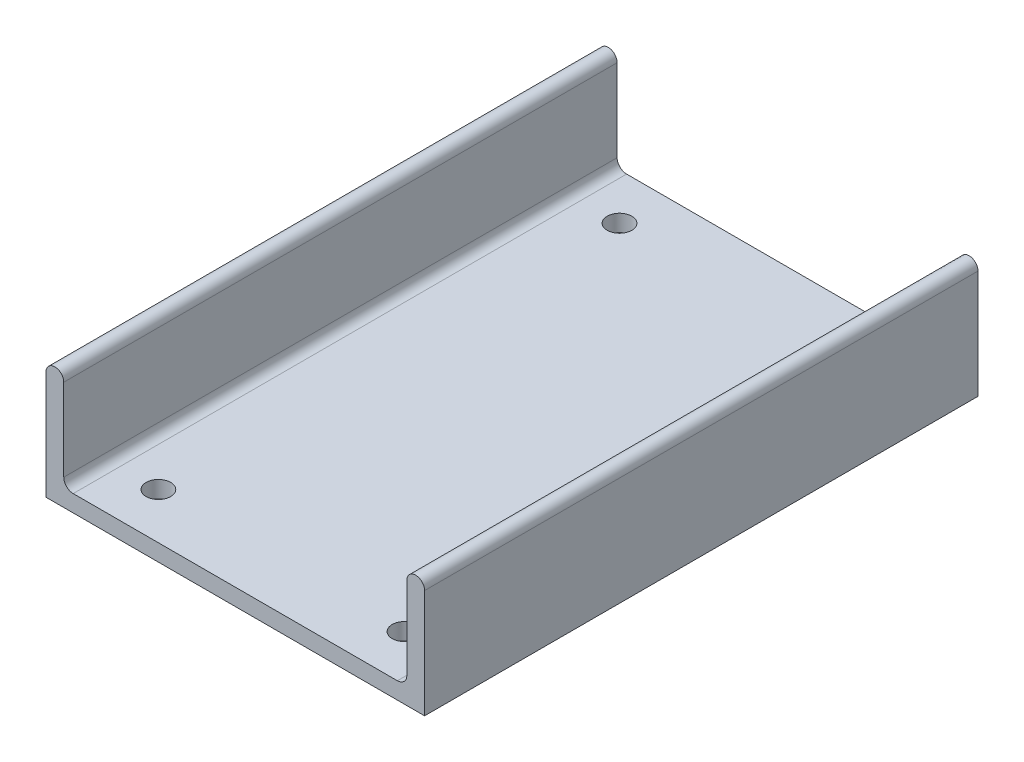
ISO-10303-21;
HEADER;
FILE_DESCRIPTION(('STEP AP214'),'2;1');
FILE_NAME('part.step','',(''),(''),'','','');
FILE_SCHEMA(('AUTOMOTIVE_DESIGN { 1 0 10303 214 1 1 1 1 }'));
ENDSEC;
DATA;
#1=APPLICATION_CONTEXT('core data for automotive mechanical design processes');
#2=APPLICATION_PROTOCOL_DEFINITION('international standard','automotive_design',2000,#1);
#3=PRODUCT_CONTEXT('',#1,'mechanical');
#4=PRODUCT('Part','Part','',(#3));
#5=PRODUCT_RELATED_PRODUCT_CATEGORY('part','',(#4));
#6=PRODUCT_DEFINITION_FORMATION('','',#4);
#7=PRODUCT_DEFINITION_CONTEXT('part definition',#1,'design');
#8=PRODUCT_DEFINITION('design','',#6,#7);
#9=PRODUCT_DEFINITION_SHAPE('','',#8);
#10=(LENGTH_UNIT() NAMED_UNIT(*) SI_UNIT(.MILLI.,.METRE.));
#11=(NAMED_UNIT(*) PLANE_ANGLE_UNIT() SI_UNIT($,.RADIAN.));
#12=(NAMED_UNIT(*) SI_UNIT($,.STERADIAN.) SOLID_ANGLE_UNIT());
#13=UNCERTAINTY_MEASURE_WITH_UNIT(LENGTH_MEASURE(1.E-05),#10,'distance_accuracy_value','');
#14=(GEOMETRIC_REPRESENTATION_CONTEXT(3) GLOBAL_UNCERTAINTY_ASSIGNED_CONTEXT((#13)) GLOBAL_UNIT_ASSIGNED_CONTEXT((#10,
#11,#12)) REPRESENTATION_CONTEXT('',''));
#15=CARTESIAN_POINT('',(0.,0.,0.));
#16=DIRECTION('',(0.,0.,1.));
#17=DIRECTION('',(1.,0.,0.));
#18=AXIS2_PLACEMENT_3D('',#15,#16,#17);
#19=CARTESIAN_POINT('',(-50.8,0.,74.25436));
#20=DIRECTION('',(-1.,0.,0.));
#21=DIRECTION('',(0.,0.,1.));
#22=AXIS2_PLACEMENT_3D('',#19,#20,#21);
#23=PLANE('',#22);
#24=DIRECTION('',(0.,1.,0.));
#25=VECTOR('',#24,1.);
#26=CARTESIAN_POINT('',(-50.8,0.,-74.25436));
#27=LINE('',#26,#25);
#28=CARTESIAN_POINT('',(-50.8,0.254,-74.25436));
#29=VERTEX_POINT('',#28);
#30=CARTESIAN_POINT('',(-50.8,29.36875,-74.25436));
#31=VERTEX_POINT('',#30);
#32=EDGE_CURVE('E135',#29,#31,#27,.T.);
#33=ORIENTED_EDGE('',*,*,#32,.F.);
#34=DIRECTION('',(0.,0.,-1.));
#35=VECTOR('',#34,1.);
#36=CARTESIAN_POINT('',(-50.8,0.254,74.25536));
#37=LINE('',#36,#35);
#38=CARTESIAN_POINT('',(-50.8,0.254,74.25436));
#39=VERTEX_POINT('',#38);
#40=EDGE_CURVE('E119',#39,#29,#37,.T.);
#41=ORIENTED_EDGE('',*,*,#40,.F.);
#42=DIRECTION('',(0.,1.,0.));
#43=VECTOR('',#42,1.);
#44=CARTESIAN_POINT('',(-50.8,0.,74.25436));
#45=LINE('',#44,#43);
#46=CARTESIAN_POINT('',(-50.8,29.36875,74.25436));
#47=VERTEX_POINT('',#46);
#48=EDGE_CURVE('E170',#39,#47,#45,.T.);
#49=ORIENTED_EDGE('',*,*,#48,.T.);
#50=DIRECTION('',(0.,0.,-1.));
#51=VECTOR('',#50,1.);
#52=CARTESIAN_POINT('',(-50.8,29.36875,74.25436));
#53=LINE('',#52,#51);
#54=EDGE_CURVE('E143',#47,#31,#53,.T.);
#55=ORIENTED_EDGE('',*,*,#54,.T.);
#56=EDGE_LOOP('',(#33,#41,#49,#55));
#57=FACE_BOUND('',#56,.T.);
#58=ADVANCED_FACE('F43',(#57),#23,.T.);
#59=CARTESIAN_POINT('',(0.,0.,74.25436));
#60=DIRECTION('',(0.,0.,-1.));
#61=DIRECTION('',(-1.,0.,0.));
#62=AXIS2_PLACEMENT_3D('',#59,#60,#61);
#63=PLANE('',#62);
#64=DIRECTION('',(1.,0.,0.));
#65=VECTOR('',#64,1.);
#66=CARTESIAN_POINT('',(-50.8,0.254,74.25436));
#67=LINE('',#66,#65);
#68=CARTESIAN_POINT('',(50.8,0.254,74.25436));
#69=VERTEX_POINT('',#68);
#70=EDGE_CURVE('E123',#39,#69,#67,.T.);
#71=ORIENTED_EDGE('',*,*,#70,.T.);
#72=DIRECTION('',(0.,1.,0.));
#73=VECTOR('',#72,1.);
#74=CARTESIAN_POINT('',(50.8,0.,74.25436));
#75=LINE('',#74,#73);
#76=CARTESIAN_POINT('',(50.8,29.36875,74.25436));
#77=VERTEX_POINT('',#76);
#78=EDGE_CURVE('E227',#69,#77,#75,.T.);
#79=ORIENTED_EDGE('',*,*,#78,.T.);
#80=CARTESIAN_POINT('',(48.41875,29.36875,74.25436));
#81=DIRECTION('',(0.,0.,1.));
#82=DIRECTION('',(1.,0.,0.));
#83=AXIS2_PLACEMENT_3D('',#80,#81,#82);
#84=CIRCLE('',#83,2.38125);
#85=CARTESIAN_POINT('',(46.0375,29.36875,74.25436));
#86=VERTEX_POINT('',#85);
#87=EDGE_CURVE('E238',#86,#77,#84,.F.);
#88=ORIENTED_EDGE('',*,*,#87,.F.);
#89=DIRECTION('',(0.,1.,0.));
#90=VECTOR('',#89,1.);
#91=CARTESIAN_POINT('',(46.0375,0.,74.25436));
#92=LINE('',#91,#90);
#93=CARTESIAN_POINT('',(46.0375,7.3025,74.25436));
#94=VERTEX_POINT('',#93);
#95=EDGE_CURVE('E224',#94,#86,#92,.T.);
#96=ORIENTED_EDGE('',*,*,#95,.F.);
#97=CARTESIAN_POINT('',(43.4975,7.3025,74.25436));
#98=DIRECTION('',(0.,0.,1.));
#99=DIRECTION('',(1.,0.,0.));
#100=AXIS2_PLACEMENT_3D('',#97,#98,#99);
#101=CIRCLE('',#100,2.54);
#102=CARTESIAN_POINT('',(43.4975,4.7625,74.25436));
#103=VERTEX_POINT('',#102);
#104=EDGE_CURVE('E157',#103,#94,#101,.T.);
#105=ORIENTED_EDGE('',*,*,#104,.F.);
#106=DIRECTION('',(1.,0.,0.));
#107=VECTOR('',#106,1.);
#108=CARTESIAN_POINT('',(0.,4.7625,74.25436));
#109=LINE('',#108,#107);
#110=CARTESIAN_POINT('',(-43.4975,4.7625,74.25436));
#111=VERTEX_POINT('',#110);
#112=EDGE_CURVE('E172',#103,#111,#109,.F.);
#113=ORIENTED_EDGE('',*,*,#112,.T.);
#114=CARTESIAN_POINT('',(-43.4975,7.3025,74.25436));
#115=DIRECTION('',(0.,0.,-1.));
#116=DIRECTION('',(-1.,0.,0.));
#117=AXIS2_PLACEMENT_3D('',#114,#115,#116);
#118=CIRCLE('',#117,2.54);
#119=CARTESIAN_POINT('',(-46.0375,7.3025,74.25436));
#120=VERTEX_POINT('',#119);
#121=EDGE_CURVE('E11',#111,#120,#118,.T.);
#122=ORIENTED_EDGE('',*,*,#121,.T.);
#123=DIRECTION('',(0.,1.,0.));
#124=VECTOR('',#123,1.);
#125=CARTESIAN_POINT('',(-46.0375,0.,74.25436));
#126=LINE('',#125,#124);
#127=CARTESIAN_POINT('',(-46.0375,29.36875,74.25436));
#128=VERTEX_POINT('',#127);
#129=EDGE_CURVE('E167',#120,#128,#126,.T.);
#130=ORIENTED_EDGE('',*,*,#129,.T.);
#131=CARTESIAN_POINT('',(-48.41875,29.36875,74.25436));
#132=DIRECTION('',(0.,0.,-1.));
#133=DIRECTION('',(-1.,0.,0.));
#134=AXIS2_PLACEMENT_3D('',#131,#132,#133);
#135=CIRCLE('',#134,2.38125);
#136=EDGE_CURVE('E181',#128,#47,#135,.F.);
#137=ORIENTED_EDGE('',*,*,#136,.T.);
#138=ORIENTED_EDGE('',*,*,#48,.F.);
#139=EDGE_LOOP('',(#71,#79,#88,#96,#105,#113,#122,#130,#137,#138));
#140=FACE_BOUND('',#139,.T.);
#141=ADVANCED_FACE('F261',(#140),#63,.F.);
#142=CARTESIAN_POINT('',(0.,0.,-74.25436));
#143=DIRECTION('',(0.,0.,1.));
#144=DIRECTION('',(-1.,0.,0.));
#145=AXIS2_PLACEMENT_3D('',#142,#143,#144);
#146=PLANE('',#145);
#147=DIRECTION('',(1.,0.,0.));
#148=VECTOR('',#147,1.);
#149=CARTESIAN_POINT('',(-50.8,0.254,-74.25436));
#150=LINE('',#149,#148);
#151=CARTESIAN_POINT('',(50.8,0.254,-74.25436));
#152=VERTEX_POINT('',#151);
#153=EDGE_CURVE('E61',#29,#152,#150,.T.);
#154=ORIENTED_EDGE('',*,*,#153,.F.);
#155=ORIENTED_EDGE('',*,*,#32,.T.);
#156=CARTESIAN_POINT('',(-48.41875,29.36875,-74.25436));
#157=DIRECTION('',(0.,0.,-1.));
#158=DIRECTION('',(-1.,0.,0.));
#159=AXIS2_PLACEMENT_3D('',#156,#157,#158);
#160=CIRCLE('',#159,2.38125);
#161=CARTESIAN_POINT('',(-46.0375,29.36875,-74.25436));
#162=VERTEX_POINT('',#161);
#163=EDGE_CURVE('E153',#162,#31,#160,.F.);
#164=ORIENTED_EDGE('',*,*,#163,.F.);
#165=DIRECTION('',(0.,1.,0.));
#166=VECTOR('',#165,1.);
#167=CARTESIAN_POINT('',(-46.0375,0.,-74.25436));
#168=LINE('',#167,#166);
#169=CARTESIAN_POINT('',(-46.0375,7.3025,-74.25436));
#170=VERTEX_POINT('',#169);
#171=EDGE_CURVE('E147',#170,#162,#168,.T.);
#172=ORIENTED_EDGE('',*,*,#171,.F.);
#173=CARTESIAN_POINT('',(-43.4975,7.3025,-74.25436));
#174=DIRECTION('',(0.,0.,-1.));
#175=DIRECTION('',(-1.,0.,0.));
#176=AXIS2_PLACEMENT_3D('',#173,#174,#175);
#177=CIRCLE('',#176,2.54);
#178=CARTESIAN_POINT('',(-43.4975,4.7625,-74.25436));
#179=VERTEX_POINT('',#178);
#180=EDGE_CURVE('E163',#179,#170,#177,.T.);
#181=ORIENTED_EDGE('',*,*,#180,.F.);
#182=DIRECTION('',(1.,0.,0.));
#183=VECTOR('',#182,1.);
#184=CARTESIAN_POINT('',(0.,4.7625,-74.25436));
#185=LINE('',#184,#183);
#186=CARTESIAN_POINT('',(43.4975,4.7625,-74.25436));
#187=VERTEX_POINT('',#186);
#188=EDGE_CURVE('E146',#187,#179,#185,.F.);
#189=ORIENTED_EDGE('',*,*,#188,.F.);
#190=CARTESIAN_POINT('',(43.4975,7.3025,-74.25436));
#191=DIRECTION('',(0.,0.,1.));
#192=DIRECTION('',(1.,0.,0.));
#193=AXIS2_PLACEMENT_3D('',#190,#191,#192);
#194=CIRCLE('',#193,2.54);
#195=CARTESIAN_POINT('',(46.0375,7.3025,-74.25436));
#196=VERTEX_POINT('',#195);
#197=EDGE_CURVE('E220',#187,#196,#194,.T.);
#198=ORIENTED_EDGE('',*,*,#197,.T.);
#199=DIRECTION('',(0.,1.,0.));
#200=VECTOR('',#199,1.);
#201=CARTESIAN_POINT('',(46.0375,0.,-74.25436));
#202=LINE('',#201,#200);
#203=CARTESIAN_POINT('',(46.0375,29.36875,-74.25436));
#204=VERTEX_POINT('',#203);
#205=EDGE_CURVE('E193',#196,#204,#202,.T.);
#206=ORIENTED_EDGE('',*,*,#205,.T.);
#207=CARTESIAN_POINT('',(48.41875,29.36875,-74.25436));
#208=DIRECTION('',(0.,0.,1.));
#209=DIRECTION('',(1.,0.,0.));
#210=AXIS2_PLACEMENT_3D('',#207,#208,#209);
#211=CIRCLE('',#210,2.38125);
#212=CARTESIAN_POINT('',(50.8,29.36875,-74.25436));
#213=VERTEX_POINT('',#212);
#214=EDGE_CURVE('E217',#204,#213,#211,.F.);
#215=ORIENTED_EDGE('',*,*,#214,.T.);
#216=DIRECTION('',(0.,1.,0.));
#217=VECTOR('',#216,1.);
#218=CARTESIAN_POINT('',(50.8,0.,-74.25436));
#219=LINE('',#218,#217);
#220=EDGE_CURVE('E138',#152,#213,#219,.T.);
#221=ORIENTED_EDGE('',*,*,#220,.F.);
#222=EDGE_LOOP('',(#154,#155,#164,#172,#181,#189,#198,#206,#215,#221));
#223=FACE_BOUND('',#222,.T.);
#224=ADVANCED_FACE('F133',(#223),#146,.F.);
#225=CARTESIAN_POINT('',(50.8,0.,74.25436));
#226=DIRECTION('',(1.,0.,0.));
#227=DIRECTION('',(0.,0.,1.));
#228=AXIS2_PLACEMENT_3D('',#225,#226,#227);
#229=PLANE('',#228);
#230=ORIENTED_EDGE('',*,*,#78,.F.);
#231=DIRECTION('',(0.,0.,-1.));
#232=VECTOR('',#231,1.);
#233=CARTESIAN_POINT('',(50.8,0.254,74.25536));
#234=LINE('',#233,#232);
#235=EDGE_CURVE('E128',#69,#152,#234,.T.);
#236=ORIENTED_EDGE('',*,*,#235,.T.);
#237=ORIENTED_EDGE('',*,*,#220,.T.);
#238=DIRECTION('',(0.,0.,-1.));
#239=VECTOR('',#238,1.);
#240=CARTESIAN_POINT('',(50.8,29.36875,74.25436));
#241=LINE('',#240,#239);
#242=EDGE_CURVE('E234',#77,#213,#241,.T.);
#243=ORIENTED_EDGE('',*,*,#242,.F.);
#244=EDGE_LOOP('',(#230,#236,#237,#243));
#245=FACE_BOUND('',#244,.T.);
#246=ADVANCED_FACE('F302',(#245),#229,.T.);
#247=CARTESIAN_POINT('',(33.02,0.,-61.87186));
#248=DIRECTION('',(0.,-1.,0.));
#249=DIRECTION('',(0.,0.,-1.));
#250=AXIS2_PLACEMENT_3D('',#247,#248,#249);
#251=CYLINDRICAL_SURFACE('',#250,3.29999999999999);
#252=CARTESIAN_POINT('',(33.02,4.7625,-61.87186));
#253=DIRECTION('',(0.,-1.,0.));
#254=DIRECTION('',(0.,0.,-1.));
#255=AXIS2_PLACEMENT_3D('',#252,#253,#254);
#256=CIRCLE('',#255,3.29999999999999);
#257=CARTESIAN_POINT('',(33.02,4.7625,-65.17186));
#258=VERTEX_POINT('',#257);
#259=EDGE_CURVE('E190',#258,#258,#256,.T.);
#260=ORIENTED_EDGE('',*,*,#259,.F.);
#261=EDGE_LOOP('',(#260));
#262=FACE_BOUND('',#261,.T.);
#263=CARTESIAN_POINT('',(33.02,0.254,-61.87186));
#264=DIRECTION('',(0.,1.,0.));
#265=DIRECTION('',(0.,0.,1.));
#266=AXIS2_PLACEMENT_3D('',#263,#264,#265);
#267=CIRCLE('',#266,3.29999999999999);
#268=CARTESIAN_POINT('',(33.02,0.254,-58.57186));
#269=VERTEX_POINT('',#268);
#270=EDGE_CURVE('E335',#269,#269,#267,.T.);
#271=ORIENTED_EDGE('',*,*,#270,.F.);
#272=EDGE_LOOP('',(#271));
#273=FACE_BOUND('',#272,.T.);
#274=ADVANCED_FACE('F311',(#262,#273),#251,.F.);
#275=CARTESIAN_POINT('',(-33.02,0.,-61.87186));
#276=DIRECTION('',(0.,-1.,0.));
#277=DIRECTION('',(0.,0.,-1.));
#278=AXIS2_PLACEMENT_3D('',#275,#276,#277);
#279=CYLINDRICAL_SURFACE('',#278,3.29999999999999);
#280=CARTESIAN_POINT('',(-33.02,4.7625,-61.87186));
#281=DIRECTION('',(0.,-1.,0.));
#282=DIRECTION('',(0.,0.,-1.));
#283=AXIS2_PLACEMENT_3D('',#280,#281,#282);
#284=CIRCLE('',#283,3.29999999999999);
#285=CARTESIAN_POINT('',(-33.02,4.7625,-65.17186));
#286=VERTEX_POINT('',#285);
#287=EDGE_CURVE('E194',#286,#286,#284,.T.);
#288=ORIENTED_EDGE('',*,*,#287,.F.);
#289=EDGE_LOOP('',(#288));
#290=FACE_BOUND('',#289,.T.);
#291=CARTESIAN_POINT('',(-33.02,0.254,-61.87186));
#292=DIRECTION('',(0.,1.,0.));
#293=DIRECTION('',(0.,0.,1.));
#294=AXIS2_PLACEMENT_3D('',#291,#292,#293);
#295=CIRCLE('',#294,3.29999999999999);
#296=CARTESIAN_POINT('',(-33.02,0.254,-58.57186));
#297=VERTEX_POINT('',#296);
#298=EDGE_CURVE('E140',#297,#297,#295,.T.);
#299=ORIENTED_EDGE('',*,*,#298,.F.);
#300=EDGE_LOOP('',(#299));
#301=FACE_BOUND('',#300,.T.);
#302=ADVANCED_FACE('F315',(#290,#301),#279,.F.);
#303=CARTESIAN_POINT('',(33.02,0.,61.87186));
#304=DIRECTION('',(0.,-1.,0.));
#305=DIRECTION('',(0.,0.,-1.));
#306=AXIS2_PLACEMENT_3D('',#303,#304,#305);
#307=CYLINDRICAL_SURFACE('',#306,3.29999999999999);
#308=CARTESIAN_POINT('',(33.02,4.7625,61.87186));
#309=DIRECTION('',(0.,-1.,0.));
#310=DIRECTION('',(0.,0.,-1.));
#311=AXIS2_PLACEMENT_3D('',#308,#309,#310);
#312=CIRCLE('',#311,3.29999999999999);
#313=CARTESIAN_POINT('',(33.02,4.7625,58.57186));
#314=VERTEX_POINT('',#313);
#315=EDGE_CURVE('E197',#314,#314,#312,.T.);
#316=ORIENTED_EDGE('',*,*,#315,.F.);
#317=EDGE_LOOP('',(#316));
#318=FACE_BOUND('',#317,.T.);
#319=CARTESIAN_POINT('',(33.02,0.254,61.87186));
#320=DIRECTION('',(0.,-1.,0.));
#321=DIRECTION('',(0.,0.,-1.));
#322=AXIS2_PLACEMENT_3D('',#319,#320,#321);
#323=CIRCLE('',#322,3.29999999999999);
#324=CARTESIAN_POINT('',(33.02,0.254,58.57186));
#325=VERTEX_POINT('',#324);
#326=EDGE_CURVE('E129',#325,#325,#323,.T.);
#327=ORIENTED_EDGE('',*,*,#326,.T.);
#328=EDGE_LOOP('',(#327));
#329=FACE_BOUND('',#328,.T.);
#330=ADVANCED_FACE('F286',(#318,#329),#307,.F.);
#331=CARTESIAN_POINT('',(-33.02,0.,61.87186));
#332=DIRECTION('',(0.,-1.,0.));
#333=DIRECTION('',(0.,0.,-1.));
#334=AXIS2_PLACEMENT_3D('',#331,#332,#333);
#335=CYLINDRICAL_SURFACE('',#334,3.29999999999999);
#336=CARTESIAN_POINT('',(-33.02,4.7625,61.87186));
#337=DIRECTION('',(0.,-1.,0.));
#338=DIRECTION('',(0.,0.,-1.));
#339=AXIS2_PLACEMENT_3D('',#336,#337,#338);
#340=CIRCLE('',#339,3.29999999999999);
#341=CARTESIAN_POINT('',(-33.02,4.7625,58.57186));
#342=VERTEX_POINT('',#341);
#343=EDGE_CURVE('E47',#342,#342,#340,.T.);
#344=ORIENTED_EDGE('',*,*,#343,.F.);
#345=EDGE_LOOP('',(#344));
#346=FACE_BOUND('',#345,.T.);
#347=CARTESIAN_POINT('',(-33.02,0.254,61.87186));
#348=DIRECTION('',(0.,-1.,0.));
#349=DIRECTION('',(0.,0.,-1.));
#350=AXIS2_PLACEMENT_3D('',#347,#348,#349);
#351=CIRCLE('',#350,3.29999999999999);
#352=CARTESIAN_POINT('',(-33.02,0.254,58.57186));
#353=VERTEX_POINT('',#352);
#354=EDGE_CURVE('E332',#353,#353,#351,.T.);
#355=ORIENTED_EDGE('',*,*,#354,.T.);
#356=EDGE_LOOP('',(#355));
#357=FACE_BOUND('',#356,.T.);
#358=ADVANCED_FACE('F280',(#346,#357),#335,.F.);
#359=CARTESIAN_POINT('',(-48.41875,29.36875,0.));
#360=DIRECTION('',(0.,0.,-1.));
#361=DIRECTION('',(-1.,0.,0.));
#362=AXIS2_PLACEMENT_3D('',#359,#360,#361);
#363=CYLINDRICAL_SURFACE('',#362,2.38125);
#364=DIRECTION('',(0.,0.,1.));
#365=VECTOR('',#364,1.);
#366=CARTESIAN_POINT('',(-46.0375,29.36875,0.));
#367=LINE('',#366,#365);
#368=EDGE_CURVE('E175',#162,#128,#367,.T.);
#369=ORIENTED_EDGE('',*,*,#368,.F.);
#370=ORIENTED_EDGE('',*,*,#163,.T.);
#371=ORIENTED_EDGE('',*,*,#54,.F.);
#372=ORIENTED_EDGE('',*,*,#136,.F.);
#373=EDGE_LOOP('',(#369,#370,#371,#372));
#374=FACE_BOUND('',#373,.T.);
#375=ADVANCED_FACE('F278',(#374),#363,.T.);
#376=CARTESIAN_POINT('',(-46.0375,0.,74.25436));
#377=DIRECTION('',(-1.,0.,0.));
#378=DIRECTION('',(0.,0.,1.));
#379=AXIS2_PLACEMENT_3D('',#376,#377,#378);
#380=PLANE('',#379);
#381=ORIENTED_EDGE('',*,*,#129,.F.);
#382=DIRECTION('',(0.,0.,-1.));
#383=VECTOR('',#382,1.);
#384=CARTESIAN_POINT('',(-46.0375,7.3025,0.));
#385=LINE('',#384,#383);
#386=EDGE_CURVE('E185',#120,#170,#385,.T.);
#387=ORIENTED_EDGE('',*,*,#386,.T.);
#388=ORIENTED_EDGE('',*,*,#171,.T.);
#389=ORIENTED_EDGE('',*,*,#368,.T.);
#390=EDGE_LOOP('',(#381,#387,#388,#389));
#391=FACE_BOUND('',#390,.T.);
#392=ADVANCED_FACE('F275',(#391),#380,.F.);
#393=CARTESIAN_POINT('',(0.,4.7625,74.25436));
#394=DIRECTION('',(0.,-1.,0.));
#395=DIRECTION('',(0.,0.,-1.));
#396=AXIS2_PLACEMENT_3D('',#393,#394,#395);
#397=PLANE('',#396);
#398=ORIENTED_EDGE('',*,*,#343,.T.);
#399=EDGE_LOOP('',(#398));
#400=FACE_BOUND('',#399,.T.);
#401=ORIENTED_EDGE('',*,*,#315,.T.);
#402=EDGE_LOOP('',(#401));
#403=FACE_BOUND('',#402,.T.);
#404=ORIENTED_EDGE('',*,*,#287,.T.);
#405=EDGE_LOOP('',(#404));
#406=FACE_BOUND('',#405,.T.);
#407=ORIENTED_EDGE('',*,*,#259,.T.);
#408=EDGE_LOOP('',(#407));
#409=FACE_BOUND('',#408,.T.);
#410=ORIENTED_EDGE('',*,*,#112,.F.);
#411=DIRECTION('',(0.,0.,-1.));
#412=VECTOR('',#411,1.);
#413=CARTESIAN_POINT('',(43.4975,4.7625,74.25436));
#414=LINE('',#413,#412);
#415=EDGE_CURVE('E245',#187,#103,#414,.F.);
#416=ORIENTED_EDGE('',*,*,#415,.F.);
#417=ORIENTED_EDGE('',*,*,#188,.T.);
#418=DIRECTION('',(0.,0.,-1.));
#419=VECTOR('',#418,1.);
#420=CARTESIAN_POINT('',(-43.4975,4.7625,74.25436));
#421=LINE('',#420,#419);
#422=EDGE_CURVE('E53',#179,#111,#421,.F.);
#423=ORIENTED_EDGE('',*,*,#422,.T.);
#424=EDGE_LOOP('',(#410,#416,#417,#423));
#425=FACE_BOUND('',#424,.T.);
#426=ADVANCED_FACE('F269',(#400,#403,#406,#409,#425),#397,.F.);
#427=CARTESIAN_POINT('',(-43.4975,7.3025,74.25436));
#428=DIRECTION('',(0.,0.,1.));
#429=DIRECTION('',(1.,0.,0.));
#430=AXIS2_PLACEMENT_3D('',#427,#428,#429);
#431=CYLINDRICAL_SURFACE('',#430,2.54);
#432=ORIENTED_EDGE('',*,*,#121,.F.);
#433=ORIENTED_EDGE('',*,*,#422,.F.);
#434=ORIENTED_EDGE('',*,*,#180,.T.);
#435=ORIENTED_EDGE('',*,*,#386,.F.);
#436=EDGE_LOOP('',(#432,#433,#434,#435));
#437=FACE_BOUND('',#436,.T.);
#438=ADVANCED_FACE('F45',(#437),#431,.F.);
#439=CARTESIAN_POINT('',(48.41875,29.36875,0.));
#440=DIRECTION('',(0.,0.,-1.));
#441=DIRECTION('',(1.,0.,0.));
#442=AXIS2_PLACEMENT_3D('',#439,#440,#441);
#443=CYLINDRICAL_SURFACE('',#442,2.38125);
#444=DIRECTION('',(0.,0.,1.));
#445=VECTOR('',#444,1.);
#446=CARTESIAN_POINT('',(46.0375,29.36875,0.));
#447=LINE('',#446,#445);
#448=EDGE_CURVE('E230',#204,#86,#447,.T.);
#449=ORIENTED_EDGE('',*,*,#448,.T.);
#450=ORIENTED_EDGE('',*,*,#87,.T.);
#451=ORIENTED_EDGE('',*,*,#242,.T.);
#452=ORIENTED_EDGE('',*,*,#214,.F.);
#453=EDGE_LOOP('',(#449,#450,#451,#452));
#454=FACE_BOUND('',#453,.T.);
#455=ADVANCED_FACE('F266',(#454),#443,.T.);
#456=CARTESIAN_POINT('',(46.0375,0.,74.25436));
#457=DIRECTION('',(1.,0.,0.));
#458=DIRECTION('',(0.,0.,1.));
#459=AXIS2_PLACEMENT_3D('',#456,#457,#458);
#460=PLANE('',#459);
#461=ORIENTED_EDGE('',*,*,#95,.T.);
#462=ORIENTED_EDGE('',*,*,#448,.F.);
#463=ORIENTED_EDGE('',*,*,#205,.F.);
#464=DIRECTION('',(0.,0.,-1.));
#465=VECTOR('',#464,1.);
#466=CARTESIAN_POINT('',(46.0375,7.3025,0.));
#467=LINE('',#466,#465);
#468=EDGE_CURVE('E242',#94,#196,#467,.T.);
#469=ORIENTED_EDGE('',*,*,#468,.F.);
#470=EDGE_LOOP('',(#461,#462,#463,#469));
#471=FACE_BOUND('',#470,.T.);
#472=ADVANCED_FACE('F259',(#471),#460,.F.);
#473=CARTESIAN_POINT('',(43.4975,7.3025,74.25436));
#474=DIRECTION('',(0.,0.,1.));
#475=DIRECTION('',(-1.,0.,0.));
#476=AXIS2_PLACEMENT_3D('',#473,#474,#475);
#477=CYLINDRICAL_SURFACE('',#476,2.54);
#478=ORIENTED_EDGE('',*,*,#104,.T.);
#479=ORIENTED_EDGE('',*,*,#468,.T.);
#480=ORIENTED_EDGE('',*,*,#197,.F.);
#481=ORIENTED_EDGE('',*,*,#415,.T.);
#482=EDGE_LOOP('',(#478,#479,#480,#481));
#483=FACE_BOUND('',#482,.T.);
#484=ADVANCED_FACE('F252',(#483),#477,.F.);
#485=CARTESIAN_POINT('',(-50.8,0.254,74.25536));
#486=DIRECTION('',(0.,-1.,0.));
#487=DIRECTION('',(0.,0.,-1.));
#488=AXIS2_PLACEMENT_3D('',#485,#486,#487);
#489=PLANE('',#488);
#490=ORIENTED_EDGE('',*,*,#326,.F.);
#491=EDGE_LOOP('',(#490));
#492=FACE_BOUND('',#491,.T.);
#493=ORIENTED_EDGE('',*,*,#354,.F.);
#494=EDGE_LOOP('',(#493));
#495=FACE_BOUND('',#494,.T.);
#496=ORIENTED_EDGE('',*,*,#40,.T.);
#497=ORIENTED_EDGE('',*,*,#153,.T.);
#498=ORIENTED_EDGE('',*,*,#235,.F.);
#499=ORIENTED_EDGE('',*,*,#70,.F.);
#500=EDGE_LOOP('',(#496,#497,#498,#499));
#501=FACE_BOUND('',#500,.T.);
#502=ORIENTED_EDGE('',*,*,#270,.T.);
#503=EDGE_LOOP('',(#502));
#504=FACE_BOUND('',#503,.T.);
#505=ORIENTED_EDGE('',*,*,#298,.T.);
#506=EDGE_LOOP('',(#505));
#507=FACE_BOUND('',#506,.T.);
#508=ADVANCED_FACE('F120',(#492,#495,#501,#504,#507),#489,.T.);
#509=CLOSED_SHELL('',(#58,#141,#224,#246,#274,#302,#330,#358,#375,#392,#426,#438,#455,#472,#484,#508));
#510=MANIFOLD_SOLID_BREP('B2',#509);
#511=ADVANCED_BREP_SHAPE_REPRESENTATION('',(#18,#510),#14);
#512=SHAPE_DEFINITION_REPRESENTATION(#9,#511);
ENDSEC;
END-ISO-10303-21;
